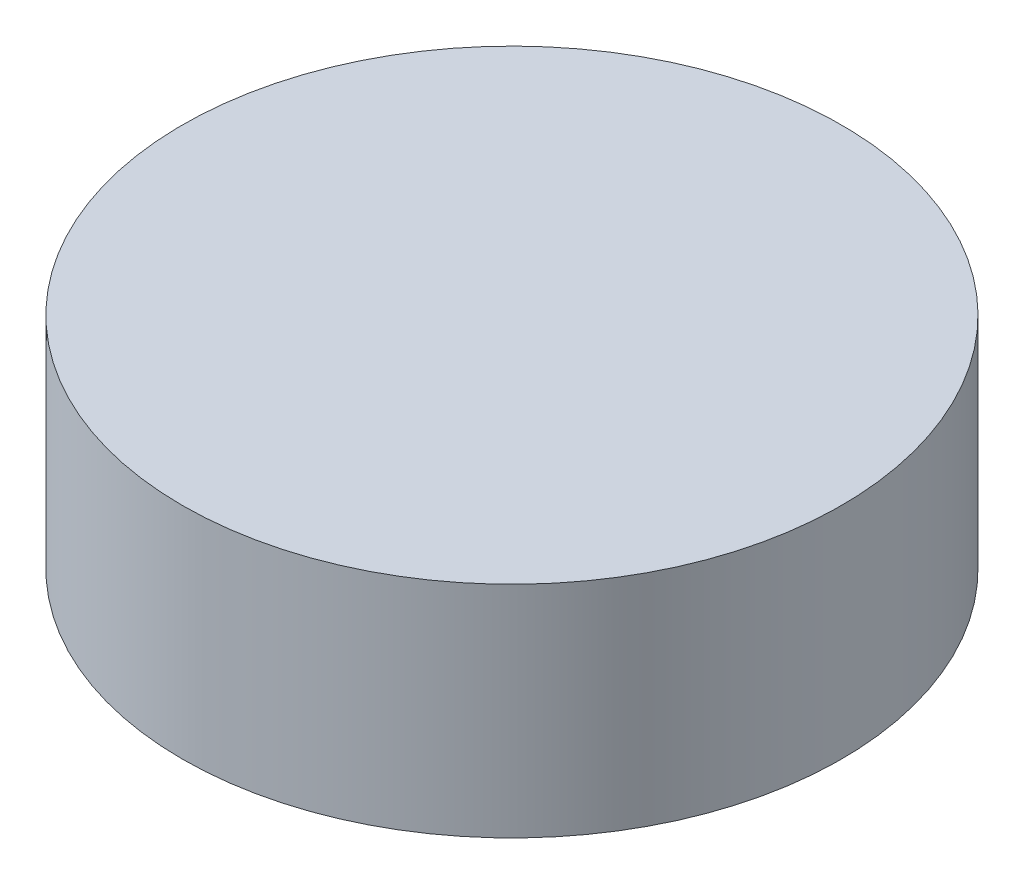
ISO-10303-21;
HEADER;
FILE_DESCRIPTION(('STEP AP214'),'2;1');
FILE_NAME('part.step','',(''),(''),'','','');
FILE_SCHEMA(('AUTOMOTIVE_DESIGN { 1 0 10303 214 1 1 1 1 }'));
ENDSEC;
DATA;
#1=APPLICATION_CONTEXT('core data for automotive mechanical design processes');
#2=APPLICATION_PROTOCOL_DEFINITION('international standard','automotive_design',2000,#1);
#3=PRODUCT_CONTEXT('',#1,'mechanical');
#4=PRODUCT('Part','Part','',(#3));
#5=PRODUCT_RELATED_PRODUCT_CATEGORY('part','',(#4));
#6=PRODUCT_DEFINITION_FORMATION('','',#4);
#7=PRODUCT_DEFINITION_CONTEXT('part definition',#1,'design');
#8=PRODUCT_DEFINITION('design','',#6,#7);
#9=PRODUCT_DEFINITION_SHAPE('','',#8);
#10=(LENGTH_UNIT() NAMED_UNIT(*) SI_UNIT(.MILLI.,.METRE.));
#11=(NAMED_UNIT(*) PLANE_ANGLE_UNIT() SI_UNIT($,.RADIAN.));
#12=(NAMED_UNIT(*) SI_UNIT($,.STERADIAN.) SOLID_ANGLE_UNIT());
#13=UNCERTAINTY_MEASURE_WITH_UNIT(LENGTH_MEASURE(1.E-05),#10,'distance_accuracy_value','');
#14=(GEOMETRIC_REPRESENTATION_CONTEXT(3) GLOBAL_UNCERTAINTY_ASSIGNED_CONTEXT((#13)) GLOBAL_UNIT_ASSIGNED_CONTEXT((#10,
#11,#12)) REPRESENTATION_CONTEXT('',''));
#15=CARTESIAN_POINT('',(0.,0.,0.));
#16=DIRECTION('',(0.,0.,1.));
#17=DIRECTION('',(1.,0.,0.));
#18=AXIS2_PLACEMENT_3D('',#15,#16,#17);
#19=CARTESIAN_POINT('',(0.,10.,0.));
#20=DIRECTION('',(0.,-1.,0.));
#21=DIRECTION('',(0.,0.,-1.));
#22=AXIS2_PLACEMENT_3D('',#19,#20,#21);
#23=CYLINDRICAL_SURFACE('',#22,30.);
#24=CARTESIAN_POINT('',(0.,10.,0.));
#25=DIRECTION('',(0.,1.,0.));
#26=DIRECTION('',(0.,0.,1.));
#27=AXIS2_PLACEMENT_3D('',#24,#25,#26);
#28=CIRCLE('',#27,30.);
#29=CARTESIAN_POINT('',(0.,10.,30.));
#30=VERTEX_POINT('',#29);
#31=EDGE_CURVE('E10',#30,#30,#28,.T.);
#32=ORIENTED_EDGE('',*,*,#31,.F.);
#33=EDGE_LOOP('',(#32));
#34=FACE_BOUND('',#33,.T.);
#35=CARTESIAN_POINT('',(0.,-10.,0.));
#36=DIRECTION('',(0.,1.,0.));
#37=DIRECTION('',(0.,0.,1.));
#38=AXIS2_PLACEMENT_3D('',#35,#36,#37);
#39=CIRCLE('',#38,30.);
#40=CARTESIAN_POINT('',(0.,-10.,30.));
#41=VERTEX_POINT('',#40);
#42=EDGE_CURVE('E34',#41,#41,#39,.T.);
#43=ORIENTED_EDGE('',*,*,#42,.T.);
#44=EDGE_LOOP('',(#43));
#45=FACE_BOUND('',#44,.T.);
#46=ADVANCED_FACE('F31',(#34,#45),#23,.T.);
#47=CARTESIAN_POINT('',(0.,10.,0.));
#48=DIRECTION('',(0.,1.,0.));
#49=DIRECTION('',(0.,0.,1.));
#50=AXIS2_PLACEMENT_3D('',#47,#48,#49);
#51=PLANE('',#50);
#52=ORIENTED_EDGE('',*,*,#31,.T.);
#53=EDGE_LOOP('',(#52));
#54=FACE_BOUND('',#53,.T.);
#55=ADVANCED_FACE('F60',(#54),#51,.T.);
#56=CARTESIAN_POINT('',(0.,-10.,0.));
#57=DIRECTION('',(0.,1.,0.));
#58=DIRECTION('',(0.,0.,1.));
#59=AXIS2_PLACEMENT_3D('',#56,#57,#58);
#60=PLANE('',#59);
#61=CARTESIAN_POINT('',(0.,-10.,0.));
#62=DIRECTION('',(0.,-1.,0.));
#63=DIRECTION('',(0.,0.,-1.));
#64=AXIS2_PLACEMENT_3D('',#61,#62,#63);
#65=CIRCLE('',#64,19.);
#66=CARTESIAN_POINT('',(0.,-10.,-19.));
#67=VERTEX_POINT('',#66);
#68=EDGE_CURVE('E43',#67,#67,#65,.T.);
#69=ORIENTED_EDGE('',*,*,#68,.F.);
#70=EDGE_LOOP('',(#69));
#71=FACE_BOUND('',#70,.T.);
#72=ORIENTED_EDGE('',*,*,#42,.F.);
#73=EDGE_LOOP('',(#72));
#74=FACE_BOUND('',#73,.T.);
#75=ADVANCED_FACE('F54',(#71,#74),#60,.F.);
#76=CARTESIAN_POINT('',(0.,5.,0.));
#77=DIRECTION('',(0.,-1.,0.));
#78=DIRECTION('',(0.,0.,-1.));
#79=AXIS2_PLACEMENT_3D('',#76,#77,#78);
#80=CYLINDRICAL_SURFACE('',#79,19.);
#81=CARTESIAN_POINT('',(0.,5.,0.));
#82=DIRECTION('',(0.,-1.,0.));
#83=DIRECTION('',(0.,0.,-1.));
#84=AXIS2_PLACEMENT_3D('',#81,#82,#83);
#85=CIRCLE('',#84,19.);
#86=CARTESIAN_POINT('',(0.,5.,-19.));
#87=VERTEX_POINT('',#86);
#88=EDGE_CURVE('E41',#87,#87,#85,.T.);
#89=ORIENTED_EDGE('',*,*,#88,.F.);
#90=EDGE_LOOP('',(#89));
#91=FACE_BOUND('',#90,.T.);
#92=ORIENTED_EDGE('',*,*,#68,.T.);
#93=EDGE_LOOP('',(#92));
#94=FACE_BOUND('',#93,.T.);
#95=ADVANCED_FACE('F51',(#91,#94),#80,.F.);
#96=CARTESIAN_POINT('',(0.,5.,0.));
#97=DIRECTION('',(0.,-1.,0.));
#98=DIRECTION('',(0.,0.,-1.));
#99=AXIS2_PLACEMENT_3D('',#96,#97,#98);
#100=PLANE('',#99);
#101=ORIENTED_EDGE('',*,*,#88,.T.);
#102=EDGE_LOOP('',(#101));
#103=FACE_BOUND('',#102,.T.);
#104=ADVANCED_FACE('F49',(#103),#100,.T.);
#105=CLOSED_SHELL('',(#46,#55,#75,#95,#104));
#106=MANIFOLD_SOLID_BREP('B2',#105);
#107=ADVANCED_BREP_SHAPE_REPRESENTATION('',(#18,#106),#14);
#108=SHAPE_DEFINITION_REPRESENTATION(#9,#107);
ENDSEC;
END-ISO-10303-21;
